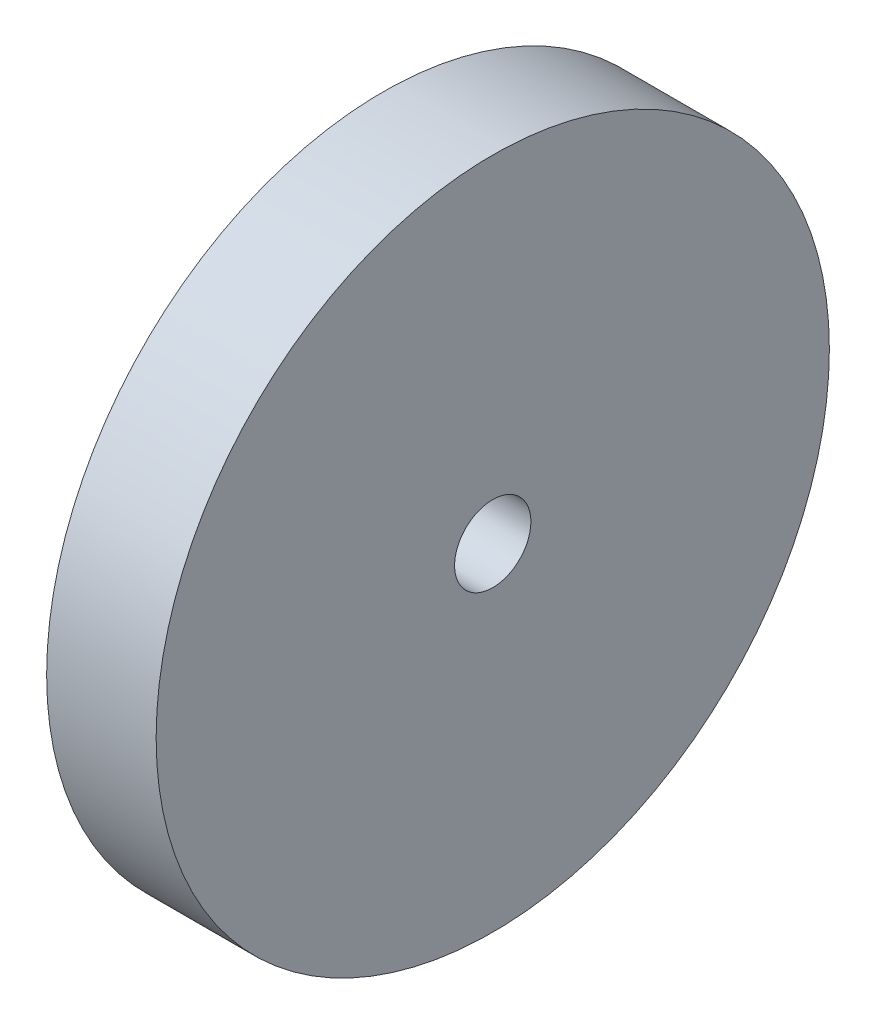
ISO-10303-21;
HEADER;
FILE_DESCRIPTION(('STEP AP214'),'2;1');
FILE_NAME('part.step','',(''),(''),'','','');
FILE_SCHEMA(('AUTOMOTIVE_DESIGN { 1 0 10303 214 1 1 1 1 }'));
ENDSEC;
DATA;
#1=APPLICATION_CONTEXT('core data for automotive mechanical design processes');
#2=APPLICATION_PROTOCOL_DEFINITION('international standard','automotive_design',2000,#1);
#3=PRODUCT_CONTEXT('',#1,'mechanical');
#4=PRODUCT('Part','Part','',(#3));
#5=PRODUCT_RELATED_PRODUCT_CATEGORY('part','',(#4));
#6=PRODUCT_DEFINITION_FORMATION('','',#4);
#7=PRODUCT_DEFINITION_CONTEXT('part definition',#1,'design');
#8=PRODUCT_DEFINITION('design','',#6,#7);
#9=PRODUCT_DEFINITION_SHAPE('','',#8);
#10=(LENGTH_UNIT() NAMED_UNIT(*) SI_UNIT(.MILLI.,.METRE.));
#11=(NAMED_UNIT(*) PLANE_ANGLE_UNIT() SI_UNIT($,.RADIAN.));
#12=(NAMED_UNIT(*) SI_UNIT($,.STERADIAN.) SOLID_ANGLE_UNIT());
#13=UNCERTAINTY_MEASURE_WITH_UNIT(LENGTH_MEASURE(1.E-05),#10,'distance_accuracy_value','');
#14=(GEOMETRIC_REPRESENTATION_CONTEXT(3) GLOBAL_UNCERTAINTY_ASSIGNED_CONTEXT((#13)) GLOBAL_UNIT_ASSIGNED_CONTEXT((#10,
#11,#12)) REPRESENTATION_CONTEXT('',''));
#15=CARTESIAN_POINT('',(0.,0.,0.));
#16=DIRECTION('',(0.,0.,1.));
#17=DIRECTION('',(1.,0.,0.));
#18=AXIS2_PLACEMENT_3D('',#15,#16,#17);
#19=CARTESIAN_POINT('',(3.0988,0.,0.));
#20=DIRECTION('',(-1.,0.,0.));
#21=DIRECTION('',(0.,0.,1.));
#22=AXIS2_PLACEMENT_3D('',#19,#20,#21);
#23=CYLINDRICAL_SURFACE('',#22,9.525);
#24=CARTESIAN_POINT('',(3.0988,0.,0.));
#25=DIRECTION('',(1.,0.,0.));
#26=DIRECTION('',(0.,0.,-1.));
#27=AXIS2_PLACEMENT_3D('',#24,#25,#26);
#28=CIRCLE('',#27,9.525);
#29=CARTESIAN_POINT('',(3.0988,0.,-9.525));
#30=VERTEX_POINT('',#29);
#31=EDGE_CURVE('E10',#30,#30,#28,.T.);
#32=ORIENTED_EDGE('',*,*,#31,.F.);
#33=EDGE_LOOP('',(#32));
#34=FACE_BOUND('',#33,.T.);
#35=CARTESIAN_POINT('',(0.,0.,0.));
#36=DIRECTION('',(1.,0.,0.));
#37=DIRECTION('',(0.,0.,-1.));
#38=AXIS2_PLACEMENT_3D('',#35,#36,#37);
#39=CIRCLE('',#38,9.525);
#40=CARTESIAN_POINT('',(0.,0.,-9.525));
#41=VERTEX_POINT('',#40);
#42=EDGE_CURVE('E33',#41,#41,#39,.T.);
#43=ORIENTED_EDGE('',*,*,#42,.T.);
#44=EDGE_LOOP('',(#43));
#45=FACE_BOUND('',#44,.T.);
#46=ADVANCED_FACE('F30',(#34,#45),#23,.T.);
#47=CARTESIAN_POINT('',(3.0988,0.,0.));
#48=DIRECTION('',(1.,0.,0.));
#49=DIRECTION('',(0.,0.,-1.));
#50=AXIS2_PLACEMENT_3D('',#47,#48,#49);
#51=PLANE('',#50);
#52=CARTESIAN_POINT('',(3.0988,0.,0.));
#53=DIRECTION('',(1.,0.,0.));
#54=DIRECTION('',(0.,0.,-1.));
#55=AXIS2_PLACEMENT_3D('',#52,#53,#54);
#56=CIRCLE('',#55,1.0795);
#57=CARTESIAN_POINT('',(3.0988,0.,-1.0795));
#58=VERTEX_POINT('',#57);
#59=EDGE_CURVE('E40',#58,#58,#56,.T.);
#60=ORIENTED_EDGE('',*,*,#59,.F.);
#61=EDGE_LOOP('',(#60));
#62=FACE_BOUND('',#61,.T.);
#63=ORIENTED_EDGE('',*,*,#31,.T.);
#64=EDGE_LOOP('',(#63));
#65=FACE_BOUND('',#64,.T.);
#66=ADVANCED_FACE('F58',(#62,#65),#51,.T.);
#67=CARTESIAN_POINT('',(0.,0.,0.));
#68=DIRECTION('',(1.,0.,0.));
#69=DIRECTION('',(0.,0.,-1.));
#70=AXIS2_PLACEMENT_3D('',#67,#68,#69);
#71=PLANE('',#70);
#72=CARTESIAN_POINT('',(0.,0.,0.));
#73=DIRECTION('',(1.,0.,0.));
#74=DIRECTION('',(0.,0.,-1.));
#75=AXIS2_PLACEMENT_3D('',#72,#73,#74);
#76=CIRCLE('',#75,1.0795);
#77=CARTESIAN_POINT('',(0.,0.,-1.0795));
#78=VERTEX_POINT('',#77);
#79=EDGE_CURVE('E44',#78,#78,#76,.T.);
#80=ORIENTED_EDGE('',*,*,#79,.T.);
#81=EDGE_LOOP('',(#80));
#82=FACE_BOUND('',#81,.T.);
#83=ORIENTED_EDGE('',*,*,#42,.F.);
#84=EDGE_LOOP('',(#83));
#85=FACE_BOUND('',#84,.T.);
#86=ADVANCED_FACE('F48',(#82,#85),#71,.F.);
#87=CARTESIAN_POINT('',(0.,0.,0.));
#88=DIRECTION('',(1.,0.,0.));
#89=DIRECTION('',(0.,0.,-1.));
#90=AXIS2_PLACEMENT_3D('',#87,#88,#89);
#91=CYLINDRICAL_SURFACE('',#90,1.0795);
#92=CARTESIAN_POINT('',(3.0988,0.,-1.0795));
#93=CARTESIAN_POINT('',(3.06652083333333,0.,-1.0795));
#94=CARTESIAN_POINT('',(3.03424166666667,0.,-1.0795));
#95=CARTESIAN_POINT('',(2.96968333333333,0.,-1.0795));
#96=CARTESIAN_POINT('',(2.93740416666667,0.,-1.0795));
#97=CARTESIAN_POINT('',(2.87284583333333,0.,-1.0795));
#98=CARTESIAN_POINT('',(2.84056666666667,0.,-1.0795));
#99=CARTESIAN_POINT('',(2.77600833333333,0.,-1.0795));
#100=CARTESIAN_POINT('',(2.74372916666667,0.,-1.0795));
#101=CARTESIAN_POINT('',(2.67917083333333,0.,-1.0795));
#102=CARTESIAN_POINT('',(2.64689166666667,0.,-1.0795));
#103=CARTESIAN_POINT('',(2.58233333333333,0.,-1.0795));
#104=CARTESIAN_POINT('',(2.55005416666667,0.,-1.0795));
#105=CARTESIAN_POINT('',(2.48549583333333,0.,-1.0795));
#106=CARTESIAN_POINT('',(2.45321666666667,0.,-1.0795));
#107=CARTESIAN_POINT('',(2.38865833333333,0.,-1.0795));
#108=CARTESIAN_POINT('',(2.35637916666667,0.,-1.0795));
#109=CARTESIAN_POINT('',(2.29182083333333,0.,-1.0795));
#110=CARTESIAN_POINT('',(2.25954166666667,0.,-1.0795));
#111=CARTESIAN_POINT('',(2.19498333333333,0.,-1.0795));
#112=CARTESIAN_POINT('',(2.16270416666667,0.,-1.0795));
#113=CARTESIAN_POINT('',(2.09814583333333,0.,-1.0795));
#114=CARTESIAN_POINT('',(2.06586666666667,0.,-1.0795));
#115=CARTESIAN_POINT('',(2.00130833333333,0.,-1.0795));
#116=CARTESIAN_POINT('',(1.96902916666667,0.,-1.0795));
#117=CARTESIAN_POINT('',(1.90447083333333,0.,-1.0795));
#118=CARTESIAN_POINT('',(1.87219166666667,0.,-1.0795));
#119=CARTESIAN_POINT('',(1.80763333333333,0.,-1.0795));
#120=CARTESIAN_POINT('',(1.77535416666667,0.,-1.0795));
#121=CARTESIAN_POINT('',(1.71079583333333,0.,-1.0795));
#122=CARTESIAN_POINT('',(1.67851666666667,0.,-1.0795));
#123=CARTESIAN_POINT('',(1.61395833333333,0.,-1.0795));
#124=CARTESIAN_POINT('',(1.58167916666667,0.,-1.0795));
#125=CARTESIAN_POINT('',(1.51712083333333,0.,-1.0795));
#126=CARTESIAN_POINT('',(1.48484166666667,0.,-1.0795));
#127=CARTESIAN_POINT('',(1.42028333333333,0.,-1.0795));
#128=CARTESIAN_POINT('',(1.38800416666667,0.,-1.0795));
#129=CARTESIAN_POINT('',(1.32344583333333,0.,-1.0795));
#130=CARTESIAN_POINT('',(1.29116666666667,0.,-1.0795));
#131=CARTESIAN_POINT('',(1.22660833333333,0.,-1.0795));
#132=CARTESIAN_POINT('',(1.19432916666667,0.,-1.0795));
#133=CARTESIAN_POINT('',(1.12977083333333,0.,-1.0795));
#134=CARTESIAN_POINT('',(1.09749166666667,0.,-1.0795));
#135=CARTESIAN_POINT('',(1.03293333333333,0.,-1.0795));
#136=CARTESIAN_POINT('',(1.00065416666667,0.,-1.0795));
#137=CARTESIAN_POINT('',(0.936095833333333,0.,-1.0795));
#138=CARTESIAN_POINT('',(0.903816666666667,0.,-1.0795));
#139=CARTESIAN_POINT('',(0.839258333333333,0.,-1.0795));
#140=CARTESIAN_POINT('',(0.806979166666666,0.,-1.0795));
#141=CARTESIAN_POINT('',(0.742420833333333,0.,-1.0795));
#142=CARTESIAN_POINT('',(0.710141666666666,0.,-1.0795));
#143=CARTESIAN_POINT('',(0.645583333333333,0.,-1.0795));
#144=CARTESIAN_POINT('',(0.613304166666666,0.,-1.0795));
#145=CARTESIAN_POINT('',(0.548745833333333,0.,-1.0795));
#146=CARTESIAN_POINT('',(0.516466666666666,0.,-1.0795));
#147=CARTESIAN_POINT('',(0.451908333333333,0.,-1.0795));
#148=CARTESIAN_POINT('',(0.419629166666666,0.,-1.0795));
#149=CARTESIAN_POINT('',(0.355070833333333,0.,-1.0795));
#150=CARTESIAN_POINT('',(0.322791666666666,0.,-1.0795));
#151=CARTESIAN_POINT('',(0.258233333333333,0.,-1.0795));
#152=CARTESIAN_POINT('',(0.225954166666667,0.,-1.0795));
#153=CARTESIAN_POINT('',(0.161395833333333,0.,-1.0795));
#154=CARTESIAN_POINT('',(0.129116666666667,0.,-1.0795));
#155=CARTESIAN_POINT('',(0.0645583333333333,0.,-1.0795));
#156=CARTESIAN_POINT('',(0.0322791666666666,0.,-1.0795));
#157=CARTESIAN_POINT('',(0.,0.,-1.0795));
#158=B_SPLINE_CURVE_WITH_KNOTS('',3,(#92,#93,#94,#95,#96,#97,#98,#99,#100,#101,#102,#103,#104,
#105,#106,#107,#108,#109,#110,#111,#112,#113,#114,#115,#116,#117,#118,#119,#120,#121,#122,#123,
#124,#125,#126,#127,#128,#129,#130,#131,#132,#133,#134,#135,#136,#137,#138,#139,#140,#141,#142,
#143,#144,#145,#146,#147,#148,#149,#150,#151,#152,#153,#154,#155,#156,#157),.UNSPECIFIED.,.F.,
.F.,(4,2,2,2,2,2,2,2,2,2,2,2,2,2,2,2,2,2,2,2,2,2,2,2,2,2,2,2,2,2,2,2,4),(0.,0.0968375,0.193675,
0.2905125,0.38735,0.4841875,0.581025,0.6778625,0.7747,0.8715375,0.968375,1.0652125,1.16205,
1.2588875,1.355725,1.4525625,1.5494,1.6462375,1.743075,1.8399125,1.93675,2.0335875,2.130425,
2.2272625,2.3241,2.4209375,2.517775,2.6146125,2.71145,2.8082875,2.905125,3.0019625,3.0988),.UNSPECIFIED.);
#159=EDGE_CURVE('BSEAM51',#58,#78,#158,.T.);
#160=ORIENTED_EDGE('',*,*,#59,.T.);
#161=ORIENTED_EDGE('',*,*,#79,.F.);
#162=ORIENTED_EDGE('',*,*,#159,.T.);
#163=ORIENTED_EDGE('',*,*,#159,.F.);
#164=EDGE_LOOP('',(#160,#162,#161,#163));
#165=FACE_BOUND('',#164,.T.);
#166=ADVANCED_FACE('F51',(#165),#91,.F.);
#167=CLOSED_SHELL('',(#46,#66,#86,#166));
#168=MANIFOLD_SOLID_BREP('B2',#167);
#169=ADVANCED_BREP_SHAPE_REPRESENTATION('',(#18,#168),#14);
#170=SHAPE_DEFINITION_REPRESENTATION(#9,#169);
ENDSEC;
END-ISO-10303-21;
